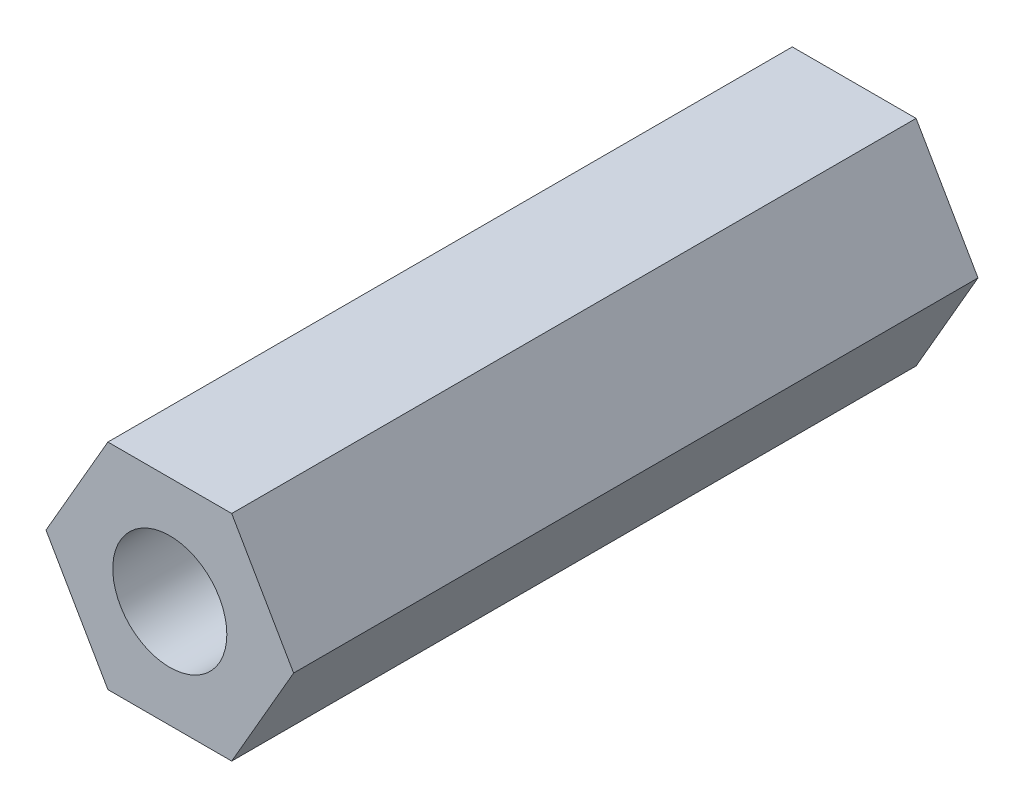
ISO-10303-21;
HEADER;
FILE_DESCRIPTION(('STEP AP214'),'2;1');
FILE_NAME('part.step','',(''),(''),'','','');
FILE_SCHEMA(('AUTOMOTIVE_DESIGN { 1 0 10303 214 1 1 1 1 }'));
ENDSEC;
DATA;
#1=APPLICATION_CONTEXT('core data for automotive mechanical design processes');
#2=APPLICATION_PROTOCOL_DEFINITION('international standard','automotive_design',2000,#1);
#3=PRODUCT_CONTEXT('',#1,'mechanical');
#4=PRODUCT('Part','Part','',(#3));
#5=PRODUCT_RELATED_PRODUCT_CATEGORY('part','',(#4));
#6=PRODUCT_DEFINITION_FORMATION('','',#4);
#7=PRODUCT_DEFINITION_CONTEXT('part definition',#1,'design');
#8=PRODUCT_DEFINITION('design','',#6,#7);
#9=PRODUCT_DEFINITION_SHAPE('','',#8);
#10=(LENGTH_UNIT() NAMED_UNIT(*) SI_UNIT(.MILLI.,.METRE.));
#11=(NAMED_UNIT(*) PLANE_ANGLE_UNIT() SI_UNIT($,.RADIAN.));
#12=(NAMED_UNIT(*) SI_UNIT($,.STERADIAN.) SOLID_ANGLE_UNIT());
#13=UNCERTAINTY_MEASURE_WITH_UNIT(LENGTH_MEASURE(1.E-05),#10,'distance_accuracy_value','');
#14=(GEOMETRIC_REPRESENTATION_CONTEXT(3) GLOBAL_UNCERTAINTY_ASSIGNED_CONTEXT((#13)) GLOBAL_UNIT_ASSIGNED_CONTEXT((#10,
#11,#12)) REPRESENTATION_CONTEXT('',''));
#15=CARTESIAN_POINT('',(0.,0.,0.));
#16=DIRECTION('',(0.,0.,1.));
#17=DIRECTION('',(1.,0.,0.));
#18=AXIS2_PLACEMENT_3D('',#15,#16,#17);
#19=CARTESIAN_POINT('',(0.,0.,-7.5));
#20=DIRECTION('',(0.,0.,1.));
#21=DIRECTION('',(1.,0.,0.));
#22=AXIS2_PLACEMENT_3D('',#19,#20,#21);
#23=PLANE('',#22);
#24=DIRECTION('',(-0.5,0.866025403784438,0.));
#25=VECTOR('',#24,1.);
#26=CARTESIAN_POINT('',(2.71354626519124,0.,-7.5));
#27=LINE('',#26,#25);
#28=CARTESIAN_POINT('',(2.71354626519124,0.,-7.5));
#29=VERTEX_POINT('',#28);
#30=CARTESIAN_POINT('',(1.35677313259562,2.35,-7.5));
#31=VERTEX_POINT('',#30);
#32=EDGE_CURVE('E127',#29,#31,#27,.T.);
#33=ORIENTED_EDGE('',*,*,#32,.F.);
#34=DIRECTION('',(0.5,0.866025403784439,0.));
#35=VECTOR('',#34,1.);
#36=CARTESIAN_POINT('',(1.35677313259562,-2.35,-7.5));
#37=LINE('',#36,#35);
#38=CARTESIAN_POINT('',(1.35677313259562,-2.35,-7.5));
#39=VERTEX_POINT('',#38);
#40=EDGE_CURVE('E88',#39,#29,#37,.T.);
#41=ORIENTED_EDGE('',*,*,#40,.F.);
#42=DIRECTION('',(1.,0.,0.));
#43=VECTOR('',#42,1.);
#44=CARTESIAN_POINT('',(-1.35677313259562,-2.35,-7.5));
#45=LINE('',#44,#43);
#46=CARTESIAN_POINT('',(-1.35677313259562,-2.35,-7.5));
#47=VERTEX_POINT('',#46);
#48=EDGE_CURVE('E82',#47,#39,#45,.T.);
#49=ORIENTED_EDGE('',*,*,#48,.F.);
#50=DIRECTION('',(0.5,-0.866025403784439,0.));
#51=VECTOR('',#50,1.);
#52=CARTESIAN_POINT('',(-2.71354626519124,0.,-7.5));
#53=LINE('',#52,#51);
#54=CARTESIAN_POINT('',(-2.71354626519124,0.,-7.5));
#55=VERTEX_POINT('',#54);
#56=EDGE_CURVE('E117',#55,#47,#53,.T.);
#57=ORIENTED_EDGE('',*,*,#56,.F.);
#58=DIRECTION('',(-0.5,-0.866025403784439,0.));
#59=VECTOR('',#58,1.);
#60=CARTESIAN_POINT('',(-1.35677313259562,2.35,-7.5));
#61=LINE('',#60,#59);
#62=CARTESIAN_POINT('',(-1.35677313259562,2.35,-7.5));
#63=VERTEX_POINT('',#62);
#64=EDGE_CURVE('E133',#63,#55,#61,.T.);
#65=ORIENTED_EDGE('',*,*,#64,.F.);
#66=DIRECTION('',(-1.,0.,0.));
#67=VECTOR('',#66,1.);
#68=CARTESIAN_POINT('',(1.35677313259562,2.35,-7.5));
#69=LINE('',#68,#67);
#70=EDGE_CURVE('E130',#31,#63,#69,.T.);
#71=ORIENTED_EDGE('',*,*,#70,.F.);
#72=EDGE_LOOP('',(#33,#41,#49,#57,#65,#71));
#73=FACE_BOUND('',#72,.T.);
#74=CARTESIAN_POINT('',(0.,0.,-7.5));
#75=DIRECTION('',(0.,0.,-1.));
#76=DIRECTION('',(-1.,0.,0.));
#77=AXIS2_PLACEMENT_3D('',#74,#75,#76);
#78=CIRCLE('',#77,1.25);
#79=CARTESIAN_POINT('',(-1.25,0.,-7.5));
#80=VERTEX_POINT('',#79);
#81=EDGE_CURVE('E178',#80,#80,#78,.T.);
#82=ORIENTED_EDGE('',*,*,#81,.F.);
#83=EDGE_LOOP('',(#82));
#84=FACE_BOUND('',#83,.T.);
#85=ADVANCED_FACE('F42',(#73,#84),#23,.F.);
#86=CARTESIAN_POINT('',(2.71354626519124,0.,7.5));
#87=DIRECTION('',(-0.866025403784438,-0.5,0.));
#88=DIRECTION('',(0.5,-0.866025403784439,0.));
#89=AXIS2_PLACEMENT_3D('',#86,#87,#88);
#90=PLANE('',#89);
#91=ORIENTED_EDGE('',*,*,#32,.T.);
#92=DIRECTION('',(0.,0.,-1.));
#93=VECTOR('',#92,1.);
#94=CARTESIAN_POINT('',(1.35677313259562,2.35,7.5));
#95=LINE('',#94,#93);
#96=CARTESIAN_POINT('',(1.35677313259562,2.35,7.5));
#97=VERTEX_POINT('',#96);
#98=EDGE_CURVE('E11',#97,#31,#95,.T.);
#99=ORIENTED_EDGE('',*,*,#98,.F.);
#100=DIRECTION('',(-0.5,0.866025403784438,0.));
#101=VECTOR('',#100,1.);
#102=CARTESIAN_POINT('',(2.71354626519124,0.,7.5));
#103=LINE('',#102,#101);
#104=CARTESIAN_POINT('',(2.71354626519124,0.,7.5));
#105=VERTEX_POINT('',#104);
#106=EDGE_CURVE('E138',#105,#97,#103,.T.);
#107=ORIENTED_EDGE('',*,*,#106,.F.);
#108=DIRECTION('',(0.,0.,-1.));
#109=VECTOR('',#108,1.);
#110=CARTESIAN_POINT('',(2.71354626519124,0.,7.5));
#111=LINE('',#110,#109);
#112=EDGE_CURVE('E123',#105,#29,#111,.T.);
#113=ORIENTED_EDGE('',*,*,#112,.T.);
#114=EDGE_LOOP('',(#91,#99,#107,#113));
#115=FACE_BOUND('',#114,.T.);
#116=ADVANCED_FACE('F44',(#115),#90,.F.);
#117=CARTESIAN_POINT('',(1.35677313259562,2.35,7.5));
#118=DIRECTION('',(0.,-1.,0.));
#119=DIRECTION('',(1.,0.,0.));
#120=AXIS2_PLACEMENT_3D('',#117,#118,#119);
#121=PLANE('',#120);
#122=ORIENTED_EDGE('',*,*,#70,.T.);
#123=DIRECTION('',(0.,0.,-1.));
#124=VECTOR('',#123,1.);
#125=CARTESIAN_POINT('',(-1.35677313259562,2.35,7.5));
#126=LINE('',#125,#124);
#127=CARTESIAN_POINT('',(-1.35677313259562,2.35,7.5));
#128=VERTEX_POINT('',#127);
#129=EDGE_CURVE('E51',#128,#63,#126,.T.);
#130=ORIENTED_EDGE('',*,*,#129,.F.);
#131=DIRECTION('',(-1.,0.,0.));
#132=VECTOR('',#131,1.);
#133=CARTESIAN_POINT('',(1.35677313259562,2.35,7.5));
#134=LINE('',#133,#132);
#135=EDGE_CURVE('E96',#97,#128,#134,.T.);
#136=ORIENTED_EDGE('',*,*,#135,.F.);
#137=ORIENTED_EDGE('',*,*,#98,.T.);
#138=EDGE_LOOP('',(#122,#130,#136,#137));
#139=FACE_BOUND('',#138,.T.);
#140=ADVANCED_FACE('F167',(#139),#121,.F.);
#141=CARTESIAN_POINT('',(-1.35677313259562,2.35,7.5));
#142=DIRECTION('',(0.866025403784439,-0.5,0.));
#143=DIRECTION('',(0.5,0.866025403784439,0.));
#144=AXIS2_PLACEMENT_3D('',#141,#142,#143);
#145=PLANE('',#144);
#146=ORIENTED_EDGE('',*,*,#64,.T.);
#147=DIRECTION('',(0.,0.,-1.));
#148=VECTOR('',#147,1.);
#149=CARTESIAN_POINT('',(-2.71354626519124,0.,7.5));
#150=LINE('',#149,#148);
#151=CARTESIAN_POINT('',(-2.71354626519124,0.,7.5));
#152=VERTEX_POINT('',#151);
#153=EDGE_CURVE('E118',#152,#55,#150,.T.);
#154=ORIENTED_EDGE('',*,*,#153,.F.);
#155=DIRECTION('',(-0.5,-0.866025403784439,0.));
#156=VECTOR('',#155,1.);
#157=CARTESIAN_POINT('',(-1.35677313259562,2.35,7.5));
#158=LINE('',#157,#156);
#159=EDGE_CURVE('E109',#128,#152,#158,.T.);
#160=ORIENTED_EDGE('',*,*,#159,.F.);
#161=ORIENTED_EDGE('',*,*,#129,.T.);
#162=EDGE_LOOP('',(#146,#154,#160,#161));
#163=FACE_BOUND('',#162,.T.);
#164=ADVANCED_FACE('F144',(#163),#145,.F.);
#165=CARTESIAN_POINT('',(-2.71354626519124,0.,7.5));
#166=DIRECTION('',(0.866025403784439,0.5,0.));
#167=DIRECTION('',(-0.5,0.866025403784439,0.));
#168=AXIS2_PLACEMENT_3D('',#165,#166,#167);
#169=PLANE('',#168);
#170=ORIENTED_EDGE('',*,*,#56,.T.);
#171=DIRECTION('',(0.,0.,-1.));
#172=VECTOR('',#171,1.);
#173=CARTESIAN_POINT('',(-1.35677313259562,-2.35,7.5));
#174=LINE('',#173,#172);
#175=CARTESIAN_POINT('',(-1.35677313259562,-2.35,7.5));
#176=VERTEX_POINT('',#175);
#177=EDGE_CURVE('E114',#176,#47,#174,.T.);
#178=ORIENTED_EDGE('',*,*,#177,.F.);
#179=DIRECTION('',(0.5,-0.866025403784439,0.));
#180=VECTOR('',#179,1.);
#181=CARTESIAN_POINT('',(-2.71354626519124,0.,7.5));
#182=LINE('',#181,#180);
#183=EDGE_CURVE('E103',#152,#176,#182,.T.);
#184=ORIENTED_EDGE('',*,*,#183,.F.);
#185=ORIENTED_EDGE('',*,*,#153,.T.);
#186=EDGE_LOOP('',(#170,#178,#184,#185));
#187=FACE_BOUND('',#186,.T.);
#188=ADVANCED_FACE('F115',(#187),#169,.F.);
#189=CARTESIAN_POINT('',(-1.35677313259562,-2.35,7.5));
#190=DIRECTION('',(0.,1.,0.));
#191=DIRECTION('',(0.,0.,1.));
#192=AXIS2_PLACEMENT_3D('',#189,#190,#191);
#193=PLANE('',#192);
#194=ORIENTED_EDGE('',*,*,#48,.T.);
#195=DIRECTION('',(0.,0.,-1.));
#196=VECTOR('',#195,1.);
#197=CARTESIAN_POINT('',(1.35677313259562,-2.35,7.5));
#198=LINE('',#197,#196);
#199=CARTESIAN_POINT('',(1.35677313259562,-2.35,7.5));
#200=VERTEX_POINT('',#199);
#201=EDGE_CURVE('E119',#200,#39,#198,.T.);
#202=ORIENTED_EDGE('',*,*,#201,.F.);
#203=DIRECTION('',(1.,0.,0.));
#204=VECTOR('',#203,1.);
#205=CARTESIAN_POINT('',(-1.35677313259562,-2.35,7.5));
#206=LINE('',#205,#204);
#207=EDGE_CURVE('E107',#176,#200,#206,.T.);
#208=ORIENTED_EDGE('',*,*,#207,.F.);
#209=ORIENTED_EDGE('',*,*,#177,.T.);
#210=EDGE_LOOP('',(#194,#202,#208,#209));
#211=FACE_BOUND('',#210,.T.);
#212=ADVANCED_FACE('F121',(#211),#193,.F.);
#213=CARTESIAN_POINT('',(1.35677313259562,-2.35,7.5));
#214=DIRECTION('',(-0.866025403784438,0.5,0.));
#215=DIRECTION('',(-0.5,-0.866025403784439,0.));
#216=AXIS2_PLACEMENT_3D('',#213,#214,#215);
#217=PLANE('',#216);
#218=ORIENTED_EDGE('',*,*,#40,.T.);
#219=ORIENTED_EDGE('',*,*,#112,.F.);
#220=DIRECTION('',(0.5,0.866025403784439,0.));
#221=VECTOR('',#220,1.);
#222=CARTESIAN_POINT('',(1.35677313259562,-2.35,7.5));
#223=LINE('',#222,#221);
#224=EDGE_CURVE('E59',#200,#105,#223,.T.);
#225=ORIENTED_EDGE('',*,*,#224,.F.);
#226=ORIENTED_EDGE('',*,*,#201,.T.);
#227=EDGE_LOOP('',(#218,#219,#225,#226));
#228=FACE_BOUND('',#227,.T.);
#229=ADVANCED_FACE('F151',(#228),#217,.F.);
#230=CARTESIAN_POINT('',(0.,0.,7.5));
#231=DIRECTION('',(0.,0.,1.));
#232=DIRECTION('',(1.,0.,0.));
#233=AXIS2_PLACEMENT_3D('',#230,#231,#232);
#234=PLANE('',#233);
#235=CARTESIAN_POINT('',(0.,0.,7.5));
#236=DIRECTION('',(0.,0.,1.));
#237=DIRECTION('',(1.,0.,0.));
#238=AXIS2_PLACEMENT_3D('',#235,#236,#237);
#239=CIRCLE('',#238,1.25);
#240=CARTESIAN_POINT('',(1.25,0.,7.5));
#241=VERTEX_POINT('',#240);
#242=EDGE_CURVE('E131',#241,#241,#239,.T.);
#243=ORIENTED_EDGE('',*,*,#242,.F.);
#244=EDGE_LOOP('',(#243));
#245=FACE_BOUND('',#244,.T.);
#246=ORIENTED_EDGE('',*,*,#106,.T.);
#247=ORIENTED_EDGE('',*,*,#135,.T.);
#248=ORIENTED_EDGE('',*,*,#159,.T.);
#249=ORIENTED_EDGE('',*,*,#183,.T.);
#250=ORIENTED_EDGE('',*,*,#207,.T.);
#251=ORIENTED_EDGE('',*,*,#224,.T.);
#252=EDGE_LOOP('',(#246,#247,#248,#249,#250,#251));
#253=FACE_BOUND('',#252,.T.);
#254=ADVANCED_FACE('F105',(#245,#253),#234,.T.);
#255=CARTESIAN_POINT('',(0.,0.,7.5));
#256=DIRECTION('',(0.,0.,1.));
#257=DIRECTION('',(1.,0.,0.));
#258=AXIS2_PLACEMENT_3D('',#255,#256,#257);
#259=CYLINDRICAL_SURFACE('',#258,1.25);
#260=ORIENTED_EDGE('',*,*,#242,.T.);
#261=EDGE_LOOP('',(#260));
#262=FACE_BOUND('',#261,.T.);
#263=ORIENTED_EDGE('',*,*,#81,.T.);
#264=EDGE_LOOP('',(#263));
#265=FACE_BOUND('',#264,.T.);
#266=ADVANCED_FACE('F158',(#262,#265),#259,.F.);
#267=CLOSED_SHELL('',(#85,#116,#140,#164,#188,#212,#229,#254,#266));
#268=MANIFOLD_SOLID_BREP('B2',#267);
#269=ADVANCED_BREP_SHAPE_REPRESENTATION('',(#18,#268),#14);
#270=SHAPE_DEFINITION_REPRESENTATION(#9,#269);
ENDSEC;
END-ISO-10303-21;
